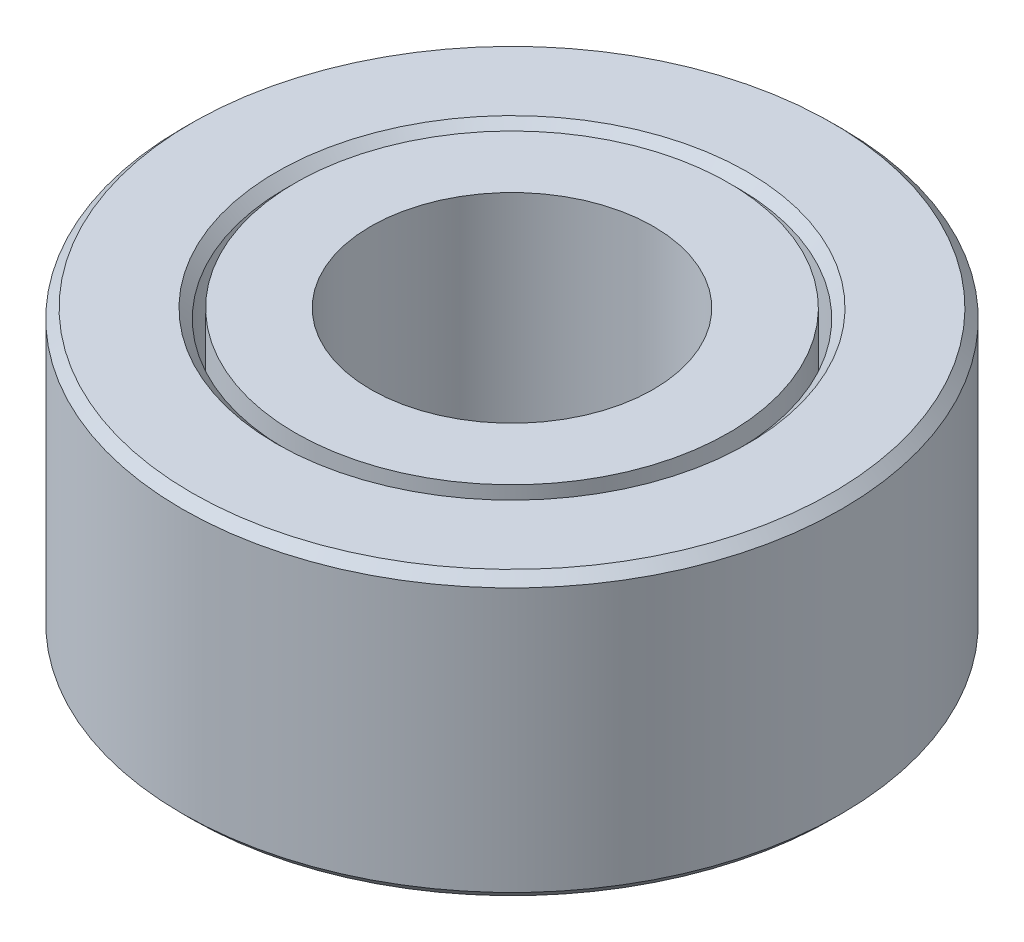
ISO-10303-21;
HEADER;
FILE_DESCRIPTION(('STEP AP214'),'2;1');
FILE_NAME('part.step','',(''),(''),'','','');
FILE_SCHEMA(('AUTOMOTIVE_DESIGN { 1 0 10303 214 1 1 1 1 }'));
ENDSEC;
DATA;
#1=APPLICATION_CONTEXT('core data for automotive mechanical design processes');
#2=APPLICATION_PROTOCOL_DEFINITION('international standard','automotive_design',2000,#1);
#3=PRODUCT_CONTEXT('',#1,'mechanical');
#4=PRODUCT('Part','Part','',(#3));
#5=PRODUCT_RELATED_PRODUCT_CATEGORY('part','',(#4));
#6=PRODUCT_DEFINITION_FORMATION('','',#4);
#7=PRODUCT_DEFINITION_CONTEXT('part definition',#1,'design');
#8=PRODUCT_DEFINITION('design','',#6,#7);
#9=PRODUCT_DEFINITION_SHAPE('','',#8);
#10=(LENGTH_UNIT() NAMED_UNIT(*) SI_UNIT(.MILLI.,.METRE.));
#11=(NAMED_UNIT(*) PLANE_ANGLE_UNIT() SI_UNIT($,.RADIAN.));
#12=(NAMED_UNIT(*) SI_UNIT($,.STERADIAN.) SOLID_ANGLE_UNIT());
#13=UNCERTAINTY_MEASURE_WITH_UNIT(LENGTH_MEASURE(1.E-05),#10,'distance_accuracy_value','');
#14=(GEOMETRIC_REPRESENTATION_CONTEXT(3) GLOBAL_UNCERTAINTY_ASSIGNED_CONTEXT((#13)) GLOBAL_UNIT_ASSIGNED_CONTEXT((#10,
#11,#12)) REPRESENTATION_CONTEXT('',''));
#15=CARTESIAN_POINT('',(0.,0.,0.));
#16=DIRECTION('',(0.,0.,1.));
#17=DIRECTION('',(1.,0.,0.));
#18=AXIS2_PLACEMENT_3D('',#15,#16,#17);
#19=CARTESIAN_POINT('',(0.,3.,0.));
#20=DIRECTION('',(0.,-1.,0.));
#21=DIRECTION('',(0.,0.,-1.));
#22=AXIS2_PLACEMENT_3D('',#19,#20,#21);
#23=CYLINDRICAL_SURFACE('',#22,1.5);
#24=CARTESIAN_POINT('',(0.,3.,0.));
#25=DIRECTION('',(0.,1.,0.));
#26=DIRECTION('',(0.,0.,1.));
#27=AXIS2_PLACEMENT_3D('',#24,#25,#26);
#28=CIRCLE('',#27,1.5);
#29=CARTESIAN_POINT('',(0.,3.,1.5));
#30=VERTEX_POINT('',#29);
#31=EDGE_CURVE('E55',#30,#30,#28,.T.);
#32=ORIENTED_EDGE('',*,*,#31,.T.);
#33=EDGE_LOOP('',(#32));
#34=FACE_BOUND('',#33,.T.);
#35=CARTESIAN_POINT('',(0.,0.,0.));
#36=DIRECTION('',(0.,1.,0.));
#37=DIRECTION('',(0.,0.,1.));
#38=AXIS2_PLACEMENT_3D('',#35,#36,#37);
#39=CIRCLE('',#38,1.5);
#40=CARTESIAN_POINT('',(0.,0.,1.5));
#41=VERTEX_POINT('',#40);
#42=EDGE_CURVE('E61',#41,#41,#39,.T.);
#43=ORIENTED_EDGE('',*,*,#42,.F.);
#44=EDGE_LOOP('',(#43));
#45=FACE_BOUND('',#44,.T.);
#46=ADVANCED_FACE('F48',(#34,#45),#23,.F.);
#47=CARTESIAN_POINT('',(0.,3.,0.));
#48=DIRECTION('',(0.,-1.,0.));
#49=DIRECTION('',(0.,0.,-1.));
#50=AXIS2_PLACEMENT_3D('',#47,#48,#49);
#51=CYLINDRICAL_SURFACE('',#50,2.3);
#52=CARTESIAN_POINT('',(0.,3.,0.));
#53=DIRECTION('',(0.,1.,0.));
#54=DIRECTION('',(0.,0.,1.));
#55=AXIS2_PLACEMENT_3D('',#52,#53,#54);
#56=CIRCLE('',#55,2.3);
#57=CARTESIAN_POINT('',(0.,3.,2.3));
#58=VERTEX_POINT('',#57);
#59=EDGE_CURVE('E12',#58,#58,#56,.T.);
#60=ORIENTED_EDGE('',*,*,#59,.F.);
#61=EDGE_LOOP('',(#60));
#62=FACE_BOUND('',#61,.T.);
#63=CARTESIAN_POINT('',(0.,0.,0.));
#64=DIRECTION('',(0.,1.,0.));
#65=DIRECTION('',(0.,0.,1.));
#66=AXIS2_PLACEMENT_3D('',#63,#64,#65);
#67=CIRCLE('',#66,2.3);
#68=CARTESIAN_POINT('',(0.,0.,2.3));
#69=VERTEX_POINT('',#68);
#70=EDGE_CURVE('E51',#69,#69,#67,.T.);
#71=ORIENTED_EDGE('',*,*,#70,.T.);
#72=EDGE_LOOP('',(#71));
#73=FACE_BOUND('',#72,.T.);
#74=ADVANCED_FACE('F68',(#62,#73),#51,.T.);
#75=CARTESIAN_POINT('',(0.,3.,0.));
#76=DIRECTION('',(0.,1.,0.));
#77=DIRECTION('',(0.,0.,1.));
#78=AXIS2_PLACEMENT_3D('',#75,#76,#77);
#79=PLANE('',#78);
#80=ORIENTED_EDGE('',*,*,#31,.F.);
#81=EDGE_LOOP('',(#80));
#82=FACE_BOUND('',#81,.T.);
#83=ORIENTED_EDGE('',*,*,#59,.T.);
#84=EDGE_LOOP('',(#83));
#85=FACE_BOUND('',#84,.T.);
#86=ADVANCED_FACE('F72',(#82,#85),#79,.T.);
#87=CARTESIAN_POINT('',(0.,0.,0.));
#88=DIRECTION('',(0.,1.,0.));
#89=DIRECTION('',(0.,0.,1.));
#90=AXIS2_PLACEMENT_3D('',#87,#88,#89);
#91=PLANE('',#90);
#92=ORIENTED_EDGE('',*,*,#42,.T.);
#93=EDGE_LOOP('',(#92));
#94=FACE_BOUND('',#93,.T.);
#95=ORIENTED_EDGE('',*,*,#70,.F.);
#96=EDGE_LOOP('',(#95));
#97=FACE_BOUND('',#96,.T.);
#98=ADVANCED_FACE('F70',(#94,#97),#91,.F.);
#99=CLOSED_SHELL('',(#46,#74,#86,#98));
#100=MANIFOLD_SOLID_BREP('B2',#99);
#101=CARTESIAN_POINT('',(0.,3.,0.));
#102=DIRECTION('',(0.,-1.,0.));
#103=DIRECTION('',(0.,0.,-1.));
#104=AXIS2_PLACEMENT_3D('',#101,#102,#103);
#105=CYLINDRICAL_SURFACE('',#104,2.4);
#106=CARTESIAN_POINT('',(0.,0.0999999999999998,0.));
#107=DIRECTION('',(0.,1.,0.));
#108=DIRECTION('',(0.,0.,1.));
#109=AXIS2_PLACEMENT_3D('',#106,#107,#108);
#110=CIRCLE('',#109,2.4);
#111=CARTESIAN_POINT('',(0.,0.0999999999999998,-2.4));
#112=VERTEX_POINT('',#111);
#113=EDGE_CURVE('E129',#112,#112,#110,.F.);
#114=ORIENTED_EDGE('',*,*,#113,.T.);
#115=EDGE_LOOP('',(#114));
#116=FACE_BOUND('',#115,.T.);
#117=CARTESIAN_POINT('',(0.,2.9,0.));
#118=DIRECTION('',(0.,1.,0.));
#119=DIRECTION('',(0.,0.,1.));
#120=AXIS2_PLACEMENT_3D('',#117,#118,#119);
#121=CIRCLE('',#120,2.4);
#122=CARTESIAN_POINT('',(0.,2.9,2.4));
#123=VERTEX_POINT('',#122);
#124=EDGE_CURVE('E132',#123,#123,#121,.T.);
#125=ORIENTED_EDGE('',*,*,#124,.T.);
#126=EDGE_LOOP('',(#125));
#127=FACE_BOUND('',#126,.T.);
#128=ADVANCED_FACE('F109',(#116,#127),#105,.F.);
#129=CARTESIAN_POINT('',(0.,3.,0.));
#130=DIRECTION('',(0.,-1.,0.));
#131=DIRECTION('',(0.,0.,-1.));
#132=AXIS2_PLACEMENT_3D('',#129,#130,#131);
#133=CYLINDRICAL_SURFACE('',#132,3.5);
#134=CARTESIAN_POINT('',(0.,0.100000000000001,0.));
#135=DIRECTION('',(0.,1.,0.));
#136=DIRECTION('',(0.,0.,1.));
#137=AXIS2_PLACEMENT_3D('',#134,#135,#136);
#138=CIRCLE('',#137,3.5);
#139=CARTESIAN_POINT('',(0.,0.100000000000001,3.5));
#140=VERTEX_POINT('',#139);
#141=EDGE_CURVE('E120',#140,#140,#138,.T.);
#142=ORIENTED_EDGE('',*,*,#141,.T.);
#143=EDGE_LOOP('',(#142));
#144=FACE_BOUND('',#143,.T.);
#145=CARTESIAN_POINT('',(0.,2.9,0.));
#146=DIRECTION('',(0.,1.,0.));
#147=DIRECTION('',(0.,0.,1.));
#148=AXIS2_PLACEMENT_3D('',#145,#146,#147);
#149=CIRCLE('',#148,3.5);
#150=CARTESIAN_POINT('',(0.,2.9,3.5));
#151=VERTEX_POINT('',#150);
#152=EDGE_CURVE('E124',#151,#151,#149,.F.);
#153=ORIENTED_EDGE('',*,*,#152,.T.);
#154=EDGE_LOOP('',(#153));
#155=FACE_BOUND('',#154,.T.);
#156=ADVANCED_FACE('F152',(#144,#155),#133,.T.);
#157=CARTESIAN_POINT('',(0.,3.,0.));
#158=DIRECTION('',(0.,1.,0.));
#159=DIRECTION('',(0.,0.,1.));
#160=AXIS2_PLACEMENT_3D('',#157,#158,#159);
#161=PLANE('',#160);
#162=CARTESIAN_POINT('',(0.,3.,0.));
#163=DIRECTION('',(0.,1.,0.));
#164=DIRECTION('',(0.,0.,1.));
#165=AXIS2_PLACEMENT_3D('',#162,#163,#164);
#166=CIRCLE('',#165,2.5);
#167=CARTESIAN_POINT('',(0.,3.,2.5));
#168=VERTEX_POINT('',#167);
#169=EDGE_CURVE('E47',#168,#168,#166,.F.);
#170=ORIENTED_EDGE('',*,*,#169,.T.);
#171=EDGE_LOOP('',(#170));
#172=FACE_BOUND('',#171,.T.);
#173=CARTESIAN_POINT('',(0.,3.,0.));
#174=DIRECTION('',(0.,1.,0.));
#175=DIRECTION('',(0.,0.,1.));
#176=AXIS2_PLACEMENT_3D('',#173,#174,#175);
#177=CIRCLE('',#176,3.4);
#178=CARTESIAN_POINT('',(0.,3.,3.4));
#179=VERTEX_POINT('',#178);
#180=EDGE_CURVE('E116',#179,#179,#177,.T.);
#181=ORIENTED_EDGE('',*,*,#180,.T.);
#182=EDGE_LOOP('',(#181));
#183=FACE_BOUND('',#182,.T.);
#184=ADVANCED_FACE('F155',(#172,#183),#161,.T.);
#185=CARTESIAN_POINT('',(0.,0.,0.));
#186=DIRECTION('',(0.,1.,0.));
#187=DIRECTION('',(0.,0.,1.));
#188=AXIS2_PLACEMENT_3D('',#185,#186,#187);
#189=PLANE('',#188);
#190=CARTESIAN_POINT('',(0.,0.,0.));
#191=DIRECTION('',(0.,1.,0.));
#192=DIRECTION('',(0.,0.,1.));
#193=AXIS2_PLACEMENT_3D('',#190,#191,#192);
#194=CIRCLE('',#193,2.5);
#195=CARTESIAN_POINT('',(0.,0.,-2.5));
#196=VERTEX_POINT('',#195);
#197=EDGE_CURVE('E135',#196,#196,#194,.T.);
#198=ORIENTED_EDGE('',*,*,#197,.T.);
#199=EDGE_LOOP('',(#198));
#200=FACE_BOUND('',#199,.T.);
#201=CARTESIAN_POINT('',(0.,0.,0.));
#202=DIRECTION('',(0.,1.,0.));
#203=DIRECTION('',(0.,0.,1.));
#204=AXIS2_PLACEMENT_3D('',#201,#202,#203);
#205=CIRCLE('',#204,3.4);
#206=CARTESIAN_POINT('',(0.,0.,3.4));
#207=VERTEX_POINT('',#206);
#208=EDGE_CURVE('E138',#207,#207,#205,.F.);
#209=ORIENTED_EDGE('',*,*,#208,.T.);
#210=EDGE_LOOP('',(#209));
#211=FACE_BOUND('',#210,.T.);
#212=ADVANCED_FACE('F142',(#200,#211),#189,.F.);
#213=CARTESIAN_POINT('',(0.,0.,0.));
#214=DIRECTION('',(0.,-1.,0.));
#215=DIRECTION('',(0.,0.,-1.));
#216=AXIS2_PLACEMENT_3D('',#213,#214,#215);
#217=CONICAL_SURFACE('',#216,2.5,0.785398163397453);
#218=CARTESIAN_POINT('',(0.,0.0999999999999998,-2.4));
#219=CARTESIAN_POINT('',(0.,0.0989583333333332,-2.40104166666667));
#220=CARTESIAN_POINT('',(0.,0.0979166666666665,-2.40208333333333));
#221=CARTESIAN_POINT('',(0.,0.0958333333333331,-2.40416666666667));
#222=CARTESIAN_POINT('',(0.,0.0947916666666665,-2.40520833333333));
#223=CARTESIAN_POINT('',(0.,0.0927083333333332,-2.40729166666667));
#224=CARTESIAN_POINT('',(0.,0.0916666666666665,-2.40833333333333));
#225=CARTESIAN_POINT('',(0.,0.0895833333333332,-2.41041666666667));
#226=CARTESIAN_POINT('',(0.,0.0885416666666665,-2.41145833333333));
#227=CARTESIAN_POINT('',(0.,0.0864583333333331,-2.41354166666667));
#228=CARTESIAN_POINT('',(0.,0.0854166666666665,-2.41458333333333));
#229=CARTESIAN_POINT('',(0.,0.0833333333333332,-2.41666666666667));
#230=CARTESIAN_POINT('',(0.,0.0822916666666665,-2.41770833333333));
#231=CARTESIAN_POINT('',(0.,0.0802083333333332,-2.41979166666667));
#232=CARTESIAN_POINT('',(0.,0.0791666666666665,-2.42083333333333));
#233=CARTESIAN_POINT('',(0.,0.0770833333333332,-2.42291666666667));
#234=CARTESIAN_POINT('',(0.,0.0760416666666665,-2.42395833333333));
#235=CARTESIAN_POINT('',(0.,0.0739583333333332,-2.42604166666667));
#236=CARTESIAN_POINT('',(0.,0.0729166666666666,-2.42708333333333));
#237=CARTESIAN_POINT('',(0.,0.0708333333333332,-2.42916666666667));
#238=CARTESIAN_POINT('',(0.,0.0697916666666665,-2.43020833333333));
#239=CARTESIAN_POINT('',(0.,0.0677083333333331,-2.43229166666667));
#240=CARTESIAN_POINT('',(0.,0.0666666666666665,-2.43333333333333));
#241=CARTESIAN_POINT('',(0.,0.0645833333333332,-2.43541666666667));
#242=CARTESIAN_POINT('',(0.,0.0635416666666665,-2.43645833333333));
#243=CARTESIAN_POINT('',(0.,0.0614583333333332,-2.43854166666667));
#244=CARTESIAN_POINT('',(0.,0.0604166666666666,-2.43958333333333));
#245=CARTESIAN_POINT('',(0.,0.0583333333333332,-2.44166666666667));
#246=CARTESIAN_POINT('',(0.,0.0572916666666666,-2.44270833333333));
#247=CARTESIAN_POINT('',(0.,0.0552083333333332,-2.44479166666667));
#248=CARTESIAN_POINT('',(0.,0.0541666666666666,-2.44583333333333));
#249=CARTESIAN_POINT('',(0.,0.0520833333333333,-2.44791666666667));
#250=CARTESIAN_POINT('',(0.,0.0510416666666665,-2.44895833333333));
#251=CARTESIAN_POINT('',(0.,0.0489583333333332,-2.45104166666667));
#252=CARTESIAN_POINT('',(0.,0.0479166666666666,-2.45208333333333));
#253=CARTESIAN_POINT('',(0.,0.0458333333333333,-2.45416666666667));
#254=CARTESIAN_POINT('',(0.,0.0447916666666666,-2.45520833333333));
#255=CARTESIAN_POINT('',(0.,0.0427083333333333,-2.45729166666667));
#256=CARTESIAN_POINT('',(0.,0.0416666666666666,-2.45833333333333));
#257=CARTESIAN_POINT('',(0.,0.0395833333333333,-2.46041666666667));
#258=CARTESIAN_POINT('',(0.,0.0385416666666666,-2.46145833333333));
#259=CARTESIAN_POINT('',(0.,0.0364583333333333,-2.46354166666667));
#260=CARTESIAN_POINT('',(0.,0.0354166666666666,-2.46458333333333));
#261=CARTESIAN_POINT('',(0.,0.0333333333333333,-2.46666666666667));
#262=CARTESIAN_POINT('',(0.,0.0322916666666666,-2.46770833333333));
#263=CARTESIAN_POINT('',(0.,0.0302083333333333,-2.46979166666667));
#264=CARTESIAN_POINT('',(0.,0.0291666666666666,-2.47083333333333));
#265=CARTESIAN_POINT('',(0.,0.0270833333333332,-2.47291666666667));
#266=CARTESIAN_POINT('',(0.,0.0260416666666666,-2.47395833333333));
#267=CARTESIAN_POINT('',(0.,0.0239583333333333,-2.47604166666667));
#268=CARTESIAN_POINT('',(0.,0.0229166666666666,-2.47708333333333));
#269=CARTESIAN_POINT('',(0.,0.0208333333333333,-2.47916666666667));
#270=CARTESIAN_POINT('',(0.,0.0197916666666666,-2.48020833333333));
#271=CARTESIAN_POINT('',(0.,0.0177083333333333,-2.48229166666667));
#272=CARTESIAN_POINT('',(0.,0.0166666666666666,-2.48333333333333));
#273=CARTESIAN_POINT('',(0.,0.0145833333333333,-2.48541666666667));
#274=CARTESIAN_POINT('',(0.,0.0135416666666667,-2.48645833333333));
#275=CARTESIAN_POINT('',(0.,0.0114583333333333,-2.48854166666667));
#276=CARTESIAN_POINT('',(0.,0.0104166666666666,-2.48958333333333));
#277=CARTESIAN_POINT('',(0.,0.00833333333333327,-2.49166666666667));
#278=CARTESIAN_POINT('',(0.,0.00729166666666664,-2.49270833333333));
#279=CARTESIAN_POINT('',(0.,0.00520833333333334,-2.49479166666667));
#280=CARTESIAN_POINT('',(0.,0.00416666666666666,-2.49583333333333));
#281=CARTESIAN_POINT('',(0.,0.00208333333333332,-2.49791666666667));
#282=CARTESIAN_POINT('',(0.,0.00104166666666665,-2.49895833333333));
#283=CARTESIAN_POINT('',(0.,0.,-2.5));
#284=B_SPLINE_CURVE_WITH_KNOTS('',3,(#218,#219,#220,#221,#222,#223,#224,#225,#226,#227,#228,
#229,#230,#231,#232,#233,#234,#235,#236,#237,#238,#239,#240,#241,#242,#243,#244,#245,#246,#247,
#248,#249,#250,#251,#252,#253,#254,#255,#256,#257,#258,#259,#260,#261,#262,#263,#264,#265,#266,
#267,#268,#269,#270,#271,#272,#273,#274,#275,#276,#277,#278,#279,#280,#281,#282,#283),
.UNSPECIFIED.,.F.,.F.,(4,2,2,2,2,2,2,2,2,2,2,2,2,2,2,2,2,2,2,2,2,2,2,2,2,2,2,2,2,2,2,2,4),(0.,
0.00441941738241598,0.00883883476483196,0.0132582521472479,0.0176776695296636,
0.0220970869120796,0.0265165042944956,0.0309359216769116,0.0353553390593275,0.0397747564417435,
0.0441941738241592,0.0486135912065752,0.0530330085889912,0.0574524259714071,0.0618718433538231,
0.0662912607362391,0.0707106781186548,0.0751300955010708,0.0795495128834867,0.0839689302659027,
0.0883883476483187,0.0928077650307347,0.0972271824131507,0.101646599795566,0.106066017177982,
0.110485434560398,0.114904851942814,0.11932426932523,0.123743686707646,0.128163104090062,
0.132582521472478,0.137001938854894,0.14142135623731),.UNSPECIFIED.);
#285=EDGE_CURVE('BSEAM148',#112,#196,#284,.T.);
#286=ORIENTED_EDGE('',*,*,#113,.F.);
#287=ORIENTED_EDGE('',*,*,#197,.F.);
#288=ORIENTED_EDGE('',*,*,#285,.T.);
#289=ORIENTED_EDGE('',*,*,#285,.F.);
#290=EDGE_LOOP('',(#286,#288,#287,#289));
#291=FACE_BOUND('',#290,.T.);
#292=ADVANCED_FACE('F148',(#291),#217,.F.);
#293=CARTESIAN_POINT('',(0.,0.100000000000001,0.));
#294=DIRECTION('',(0.,1.,0.));
#295=DIRECTION('',(0.,0.,1.));
#296=AXIS2_PLACEMENT_3D('',#293,#294,#295);
#297=CONICAL_SURFACE('',#296,3.5,0.785398163397453);
#298=ORIENTED_EDGE('',*,*,#208,.F.);
#299=EDGE_LOOP('',(#298));
#300=FACE_BOUND('',#299,.T.);
#301=ORIENTED_EDGE('',*,*,#141,.F.);
#302=EDGE_LOOP('',(#301));
#303=FACE_BOUND('',#302,.T.);
#304=ADVANCED_FACE('F144',(#300,#303),#297,.T.);
#305=CARTESIAN_POINT('',(0.,2.9,0.));
#306=DIRECTION('',(0.,1.,0.));
#307=DIRECTION('',(0.,0.,1.));
#308=AXIS2_PLACEMENT_3D('',#305,#306,#307);
#309=CONICAL_SURFACE('',#308,2.4,0.785398163397448);
#310=ORIENTED_EDGE('',*,*,#169,.F.);
#311=EDGE_LOOP('',(#310));
#312=FACE_BOUND('',#311,.T.);
#313=ORIENTED_EDGE('',*,*,#124,.F.);
#314=EDGE_LOOP('',(#313));
#315=FACE_BOUND('',#314,.T.);
#316=ADVANCED_FACE('F147',(#312,#315),#309,.F.);
#317=CARTESIAN_POINT('',(0.,3.,0.));
#318=DIRECTION('',(0.,-1.,0.));
#319=DIRECTION('',(0.,0.,-1.));
#320=AXIS2_PLACEMENT_3D('',#317,#318,#319);
#321=CONICAL_SURFACE('',#320,3.4,0.785398163397455);
#322=ORIENTED_EDGE('',*,*,#152,.F.);
#323=EDGE_LOOP('',(#322));
#324=FACE_BOUND('',#323,.T.);
#325=ORIENTED_EDGE('',*,*,#180,.F.);
#326=EDGE_LOOP('',(#325));
#327=FACE_BOUND('',#326,.T.);
#328=ADVANCED_FACE('F111',(#324,#327),#321,.T.);
#329=CLOSED_SHELL('',(#128,#156,#184,#212,#292,#304,#316,#328));
#330=MANIFOLD_SOLID_BREP('B7',#329);
#331=ADVANCED_BREP_SHAPE_REPRESENTATION('',(#18,#100,#330),#14);
#332=SHAPE_DEFINITION_REPRESENTATION(#9,#331);
ENDSEC;
END-ISO-10303-21;
